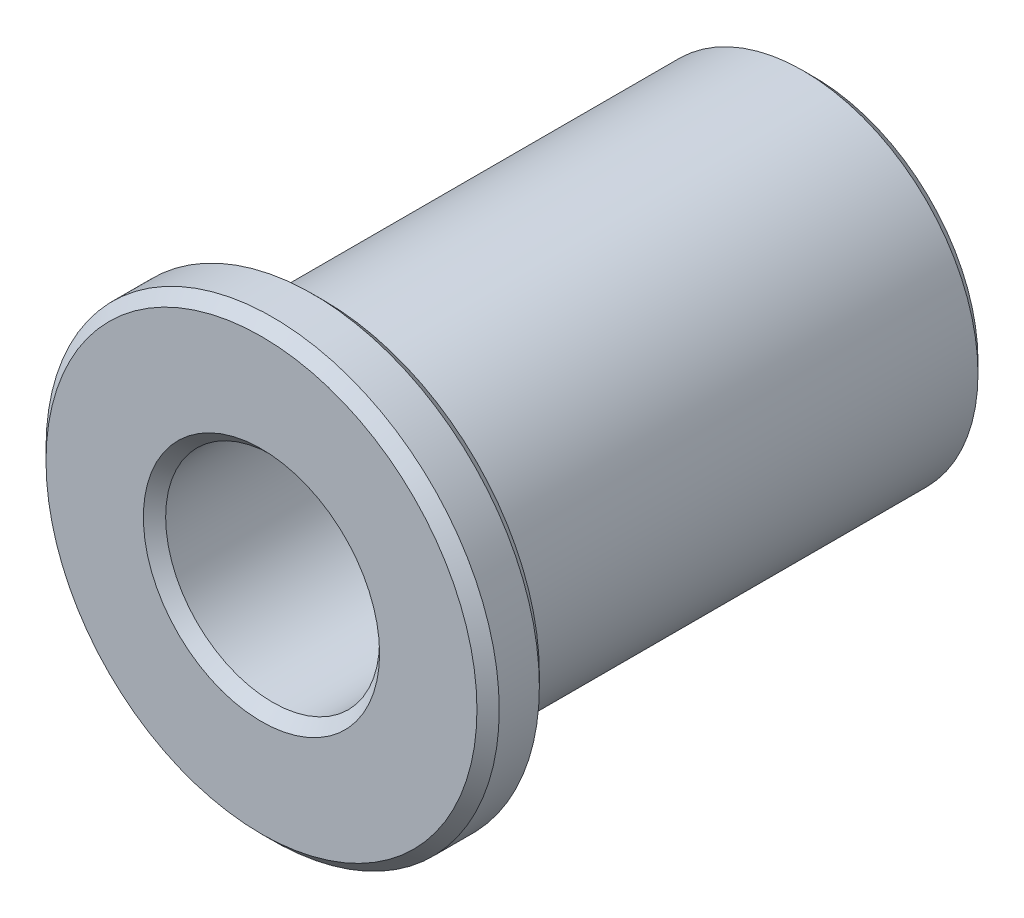
ISO-10303-21;
HEADER;
FILE_DESCRIPTION(('STEP AP214'),'2;1');
FILE_NAME('part.step','',(''),(''),'','','');
FILE_SCHEMA(('AUTOMOTIVE_DESIGN { 1 0 10303 214 1 1 1 1 }'));
ENDSEC;
DATA;
#1=APPLICATION_CONTEXT('core data for automotive mechanical design processes');
#2=APPLICATION_PROTOCOL_DEFINITION('international standard','automotive_design',2000,#1);
#3=PRODUCT_CONTEXT('',#1,'mechanical');
#4=PRODUCT('Part','Part','',(#3));
#5=PRODUCT_RELATED_PRODUCT_CATEGORY('part','',(#4));
#6=PRODUCT_DEFINITION_FORMATION('','',#4);
#7=PRODUCT_DEFINITION_CONTEXT('part definition',#1,'design');
#8=PRODUCT_DEFINITION('design','',#6,#7);
#9=PRODUCT_DEFINITION_SHAPE('','',#8);
#10=(LENGTH_UNIT() NAMED_UNIT(*) SI_UNIT(.MILLI.,.METRE.));
#11=(NAMED_UNIT(*) PLANE_ANGLE_UNIT() SI_UNIT($,.RADIAN.));
#12=(NAMED_UNIT(*) SI_UNIT($,.STERADIAN.) SOLID_ANGLE_UNIT());
#13=UNCERTAINTY_MEASURE_WITH_UNIT(LENGTH_MEASURE(1.E-05),#10,'distance_accuracy_value','');
#14=(GEOMETRIC_REPRESENTATION_CONTEXT(3) GLOBAL_UNCERTAINTY_ASSIGNED_CONTEXT((#13)) GLOBAL_UNIT_ASSIGNED_CONTEXT((#10,
#11,#12)) REPRESENTATION_CONTEXT('',''));
#15=CARTESIAN_POINT('',(0.,0.,0.));
#16=DIRECTION('',(0.,0.,1.));
#17=DIRECTION('',(1.,0.,0.));
#18=AXIS2_PLACEMENT_3D('',#15,#16,#17);
#19=CARTESIAN_POINT('',(0.,0.,-11.));
#20=DIRECTION('',(0.,0.,1.));
#21=DIRECTION('',(1.,0.,0.));
#22=AXIS2_PLACEMENT_3D('',#19,#20,#21);
#23=CYLINDRICAL_SURFACE('',#22,3.925);
#24=CARTESIAN_POINT('',(0.,0.,-10.75));
#25=DIRECTION('',(0.,0.,1.));
#26=DIRECTION('',(1.,0.,0.));
#27=AXIS2_PLACEMENT_3D('',#24,#25,#26);
#28=CIRCLE('',#27,3.925);
#29=CARTESIAN_POINT('',(3.925,0.,-10.75));
#30=VERTEX_POINT('',#29);
#31=EDGE_CURVE('E50',#30,#30,#28,.T.);
#32=ORIENTED_EDGE('',*,*,#31,.T.);
#33=EDGE_LOOP('',(#32));
#34=FACE_BOUND('',#33,.T.);
#35=CARTESIAN_POINT('',(0.,0.,0.));
#36=DIRECTION('',(0.,0.,1.));
#37=DIRECTION('',(1.,0.,0.));
#38=AXIS2_PLACEMENT_3D('',#35,#36,#37);
#39=CIRCLE('',#38,3.925);
#40=CARTESIAN_POINT('',(3.925,0.,0.));
#41=VERTEX_POINT('',#40);
#42=EDGE_CURVE('E68',#41,#41,#39,.T.);
#43=ORIENTED_EDGE('',*,*,#42,.F.);
#44=EDGE_LOOP('',(#43));
#45=FACE_BOUND('',#44,.T.);
#46=ADVANCED_FACE('F30',(#34,#45),#23,.T.);
#47=CARTESIAN_POINT('',(0.,0.,-11.));
#48=DIRECTION('',(0.,0.,1.));
#49=DIRECTION('',(1.,0.,0.));
#50=AXIS2_PLACEMENT_3D('',#47,#48,#49);
#51=PLANE('',#50);
#52=CARTESIAN_POINT('',(0.,0.,-11.));
#53=DIRECTION('',(0.,0.,1.));
#54=DIRECTION('',(1.,0.,0.));
#55=AXIS2_PLACEMENT_3D('',#52,#53,#54);
#56=CIRCLE('',#55,3.67499999999999);
#57=CARTESIAN_POINT('',(3.67499999999999,0.,-11.));
#58=VERTEX_POINT('',#57);
#59=EDGE_CURVE('E41',#58,#58,#56,.F.);
#60=ORIENTED_EDGE('',*,*,#59,.T.);
#61=EDGE_LOOP('',(#60));
#62=FACE_BOUND('',#61,.T.);
#63=CARTESIAN_POINT('',(0.,0.,-11.));
#64=DIRECTION('',(0.,0.,1.));
#65=DIRECTION('',(1.,0.,0.));
#66=AXIS2_PLACEMENT_3D('',#63,#64,#65);
#67=CIRCLE('',#66,2.64999999999999);
#68=CARTESIAN_POINT('',(2.64999999999999,0.,-11.));
#69=VERTEX_POINT('',#68);
#70=EDGE_CURVE('E45',#69,#69,#67,.T.);
#71=ORIENTED_EDGE('',*,*,#70,.T.);
#72=EDGE_LOOP('',(#71));
#73=FACE_BOUND('',#72,.T.);
#74=ADVANCED_FACE('F75',(#62,#73),#51,.F.);
#75=CARTESIAN_POINT('',(0.,0.,1.4));
#76=DIRECTION('',(0.,0.,-1.));
#77=DIRECTION('',(-1.,0.,0.));
#78=AXIS2_PLACEMENT_3D('',#75,#76,#77);
#79=CYLINDRICAL_SURFACE('',#78,5.08414963527469);
#80=CARTESIAN_POINT('',(0.,0.,0.250000000000003));
#81=DIRECTION('',(0.,0.,1.));
#82=DIRECTION('',(1.,0.,0.));
#83=AXIS2_PLACEMENT_3D('',#80,#81,#82);
#84=CIRCLE('',#83,5.08414963527469);
#85=CARTESIAN_POINT('',(5.08414963527469,0.,0.250000000000003));
#86=VERTEX_POINT('',#85);
#87=EDGE_CURVE('E62',#86,#86,#84,.T.);
#88=ORIENTED_EDGE('',*,*,#87,.T.);
#89=EDGE_LOOP('',(#88));
#90=FACE_BOUND('',#89,.T.);
#91=CARTESIAN_POINT('',(0.,0.,1.15));
#92=DIRECTION('',(0.,0.,1.));
#93=DIRECTION('',(1.,0.,0.));
#94=AXIS2_PLACEMENT_3D('',#91,#92,#93);
#95=CIRCLE('',#94,5.08414963527469);
#96=CARTESIAN_POINT('',(5.08414963527469,0.,1.15));
#97=VERTEX_POINT('',#96);
#98=EDGE_CURVE('E65',#97,#97,#95,.F.);
#99=ORIENTED_EDGE('',*,*,#98,.T.);
#100=EDGE_LOOP('',(#99));
#101=FACE_BOUND('',#100,.T.);
#102=ADVANCED_FACE('F81',(#90,#101),#79,.T.);
#103=CARTESIAN_POINT('',(0.,0.,1.4));
#104=DIRECTION('',(0.,0.,1.));
#105=DIRECTION('',(1.,0.,0.));
#106=AXIS2_PLACEMENT_3D('',#103,#104,#105);
#107=PLANE('',#106);
#108=CARTESIAN_POINT('',(0.,0.,1.4));
#109=DIRECTION('',(0.,0.,1.));
#110=DIRECTION('',(1.,0.,0.));
#111=AXIS2_PLACEMENT_3D('',#108,#109,#110);
#112=CIRCLE('',#111,4.83414963527468);
#113=CARTESIAN_POINT('',(4.83414963527468,0.,1.4));
#114=VERTEX_POINT('',#113);
#115=EDGE_CURVE('E53',#114,#114,#112,.T.);
#116=ORIENTED_EDGE('',*,*,#115,.T.);
#117=EDGE_LOOP('',(#116));
#118=FACE_BOUND('',#117,.T.);
#119=CARTESIAN_POINT('',(0.,0.,1.4));
#120=DIRECTION('',(0.,0.,1.));
#121=DIRECTION('',(1.,0.,0.));
#122=AXIS2_PLACEMENT_3D('',#119,#120,#121);
#123=CIRCLE('',#122,2.65000000000001);
#124=CARTESIAN_POINT('',(2.65000000000001,0.,1.4));
#125=VERTEX_POINT('',#124);
#126=EDGE_CURVE('E56',#125,#125,#123,.F.);
#127=ORIENTED_EDGE('',*,*,#126,.T.);
#128=EDGE_LOOP('',(#127));
#129=FACE_BOUND('',#128,.T.);
#130=ADVANCED_FACE('F113',(#118,#129),#107,.T.);
#131=CARTESIAN_POINT('',(0.,0.,0.));
#132=DIRECTION('',(0.,0.,1.));
#133=DIRECTION('',(1.,0.,0.));
#134=AXIS2_PLACEMENT_3D('',#131,#132,#133);
#135=PLANE('',#134);
#136=CARTESIAN_POINT('',(0.,0.,0.));
#137=DIRECTION('',(0.,0.,1.));
#138=DIRECTION('',(1.,0.,0.));
#139=AXIS2_PLACEMENT_3D('',#136,#137,#138);
#140=CIRCLE('',#139,4.83414963527468);
#141=CARTESIAN_POINT('',(4.83414963527468,0.,0.));
#142=VERTEX_POINT('',#141);
#143=EDGE_CURVE('E59',#142,#142,#140,.F.);
#144=ORIENTED_EDGE('',*,*,#143,.T.);
#145=EDGE_LOOP('',(#144));
#146=FACE_BOUND('',#145,.T.);
#147=ORIENTED_EDGE('',*,*,#42,.T.);
#148=EDGE_LOOP('',(#147));
#149=FACE_BOUND('',#148,.T.);
#150=ADVANCED_FACE('F72',(#146,#149),#135,.F.);
#151=CARTESIAN_POINT('',(0.,0.,-11.));
#152=DIRECTION('',(0.,0.,1.));
#153=DIRECTION('',(1.,0.,0.));
#154=AXIS2_PLACEMENT_3D('',#151,#152,#153);
#155=CYLINDRICAL_SURFACE('',#154,2.4);
#156=CARTESIAN_POINT('',(0.,0.,-10.75));
#157=DIRECTION('',(0.,0.,1.));
#158=DIRECTION('',(1.,0.,0.));
#159=AXIS2_PLACEMENT_3D('',#156,#157,#158);
#160=CIRCLE('',#159,2.4);
#161=CARTESIAN_POINT('',(2.4,0.,-10.75));
#162=VERTEX_POINT('',#161);
#163=EDGE_CURVE('E10',#162,#162,#160,.F.);
#164=CARTESIAN_POINT('',(0.,0.,1.14999999999999));
#165=DIRECTION('',(0.,0.,1.));
#166=DIRECTION('',(1.,0.,0.));
#167=AXIS2_PLACEMENT_3D('',#164,#165,#166);
#168=CIRCLE('',#167,2.4);
#169=CARTESIAN_POINT('',(2.4,0.,1.14999999999999));
#170=VERTEX_POINT('',#169);
#171=EDGE_CURVE('E37',#170,#170,#168,.T.);
#172=CARTESIAN_POINT('',(2.4,0.,-10.75));
#173=CARTESIAN_POINT('',(2.4,0.,-10.6260416666667));
#174=CARTESIAN_POINT('',(2.4,0.,-10.5020833333333));
#175=CARTESIAN_POINT('',(2.4,0.,-10.2541666666667));
#176=CARTESIAN_POINT('',(2.4,0.,-10.1302083333333));
#177=CARTESIAN_POINT('',(2.4,0.,-9.88229166666667));
#178=CARTESIAN_POINT('',(2.4,0.,-9.75833333333334));
#179=CARTESIAN_POINT('',(2.4,0.,-9.51041666666667));
#180=CARTESIAN_POINT('',(2.4,0.,-9.38645833333334));
#181=CARTESIAN_POINT('',(2.4,0.,-9.13854166666667));
#182=CARTESIAN_POINT('',(2.4,0.,-9.01458333333334));
#183=CARTESIAN_POINT('',(2.4,0.,-8.76666666666667));
#184=CARTESIAN_POINT('',(2.4,0.,-8.64270833333334));
#185=CARTESIAN_POINT('',(2.4,0.,-8.39479166666667));
#186=CARTESIAN_POINT('',(2.4,0.,-8.27083333333334));
#187=CARTESIAN_POINT('',(2.4,0.,-8.02291666666667));
#188=CARTESIAN_POINT('',(2.4,0.,-7.89895833333334));
#189=CARTESIAN_POINT('',(2.4,0.,-7.65104166666667));
#190=CARTESIAN_POINT('',(2.4,0.,-7.52708333333334));
#191=CARTESIAN_POINT('',(2.4,0.,-7.27916666666667));
#192=CARTESIAN_POINT('',(2.4,0.,-7.15520833333334));
#193=CARTESIAN_POINT('',(2.4,0.,-6.90729166666668));
#194=CARTESIAN_POINT('',(2.4,0.,-6.78333333333334));
#195=CARTESIAN_POINT('',(2.4,0.,-6.53541666666668));
#196=CARTESIAN_POINT('',(2.4,0.,-6.41145833333334));
#197=CARTESIAN_POINT('',(2.4,0.,-6.16354166666668));
#198=CARTESIAN_POINT('',(2.4,0.,-6.03958333333334));
#199=CARTESIAN_POINT('',(2.4,0.,-5.79166666666668));
#200=CARTESIAN_POINT('',(2.4,0.,-5.66770833333334));
#201=CARTESIAN_POINT('',(2.4,0.,-5.41979166666668));
#202=CARTESIAN_POINT('',(2.4,0.,-5.29583333333334));
#203=CARTESIAN_POINT('',(2.4,0.,-5.04791666666668));
#204=CARTESIAN_POINT('',(2.4,0.,-4.92395833333334));
#205=CARTESIAN_POINT('',(2.4,0.,-4.67604166666668));
#206=CARTESIAN_POINT('',(2.4,0.,-4.55208333333334));
#207=CARTESIAN_POINT('',(2.4,0.,-4.30416666666668));
#208=CARTESIAN_POINT('',(2.4,0.,-4.18020833333334));
#209=CARTESIAN_POINT('',(2.4,0.,-3.93229166666668));
#210=CARTESIAN_POINT('',(2.4,0.,-3.80833333333334));
#211=CARTESIAN_POINT('',(2.4,0.,-3.56041666666668));
#212=CARTESIAN_POINT('',(2.4,0.,-3.43645833333334));
#213=CARTESIAN_POINT('',(2.4,0.,-3.18854166666668));
#214=CARTESIAN_POINT('',(2.4,0.,-3.06458333333334));
#215=CARTESIAN_POINT('',(2.4,0.,-2.81666666666668));
#216=CARTESIAN_POINT('',(2.4,0.,-2.69270833333335));
#217=CARTESIAN_POINT('',(2.4,0.,-2.44479166666668));
#218=CARTESIAN_POINT('',(2.4,0.,-2.32083333333334));
#219=CARTESIAN_POINT('',(2.4,0.,-2.07291666666668));
#220=CARTESIAN_POINT('',(2.4,0.,-1.94895833333335));
#221=CARTESIAN_POINT('',(2.4,0.,-1.70104166666668));
#222=CARTESIAN_POINT('',(2.4,0.,-1.57708333333335));
#223=CARTESIAN_POINT('',(2.4,0.,-1.32916666666668));
#224=CARTESIAN_POINT('',(2.4,0.,-1.20520833333335));
#225=CARTESIAN_POINT('',(2.4,0.,-0.957291666666679));
#226=CARTESIAN_POINT('',(2.4,0.,-0.833333333333346));
#227=CARTESIAN_POINT('',(2.4,0.,-0.585416666666679));
#228=CARTESIAN_POINT('',(2.4,0.,-0.461458333333346));
#229=CARTESIAN_POINT('',(2.4,0.,-0.21354166666668));
#230=CARTESIAN_POINT('',(2.4,0.,-0.089583333333346));
#231=CARTESIAN_POINT('',(2.4,0.,0.158333333333321));
#232=CARTESIAN_POINT('',(2.4,0.,0.282291666666654));
#233=CARTESIAN_POINT('',(2.4,0.,0.53020833333332));
#234=CARTESIAN_POINT('',(2.4,0.,0.654166666666654));
#235=CARTESIAN_POINT('',(2.4,0.,0.90208333333332));
#236=CARTESIAN_POINT('',(2.4,0.,1.02604166666665));
#237=CARTESIAN_POINT('',(2.4,0.,1.14999999999999));
#238=B_SPLINE_CURVE_WITH_KNOTS('',3,(#172,#173,#174,#175,#176,#177,#178,#179,#180,#181,#182,
#183,#184,#185,#186,#187,#188,#189,#190,#191,#192,#193,#194,#195,#196,#197,#198,#199,#200,#201,
#202,#203,#204,#205,#206,#207,#208,#209,#210,#211,#212,#213,#214,#215,#216,#217,#218,#219,#220,
#221,#222,#223,#224,#225,#226,#227,#228,#229,#230,#231,#232,#233,#234,#235,#236,#237),
.UNSPECIFIED.,.F.,.F.,(4,2,2,2,2,2,2,2,2,2,2,2,2,2,2,2,2,2,2,2,2,2,2,2,2,2,2,2,2,2,2,2,4),(0.,
0.371874999999999,0.743749999999998,1.115625,1.4875,1.859375,2.23125,2.603125,2.975,3.346875,
3.71875,4.090625,4.4625,4.834375,5.20624999999999,5.57812499999999,5.94999999999999,
6.32187499999999,6.69374999999999,7.06562499999999,7.43749999999999,7.80937499999999,
8.18124999999999,8.55312499999999,8.92499999999999,9.29687499999999,9.66874999999999,10.040625,
10.4125,10.784375,11.15625,11.528125,11.9),.UNSPECIFIED.);
#239=EDGE_CURVE('BSEAM90',#162,#170,#238,.T.);
#240=ORIENTED_EDGE('',*,*,#163,.T.);
#241=ORIENTED_EDGE('',*,*,#171,.T.);
#242=ORIENTED_EDGE('',*,*,#239,.T.);
#243=ORIENTED_EDGE('',*,*,#239,.F.);
#244=EDGE_LOOP('',(#240,#242,#241,#243));
#245=FACE_BOUND('',#244,.T.);
#246=ADVANCED_FACE('F90',(#245),#155,.F.);
#247=CARTESIAN_POINT('',(0.,0.,0.250000000000003));
#248=DIRECTION('',(0.,0.,1.));
#249=DIRECTION('',(1.,0.,0.));
#250=AXIS2_PLACEMENT_3D('',#247,#248,#249);
#251=CONICAL_SURFACE('',#250,5.08414963527469,0.785398163397452);
#252=ORIENTED_EDGE('',*,*,#143,.F.);
#253=EDGE_LOOP('',(#252));
#254=FACE_BOUND('',#253,.T.);
#255=ORIENTED_EDGE('',*,*,#87,.F.);
#256=EDGE_LOOP('',(#255));
#257=FACE_BOUND('',#256,.T.);
#258=ADVANCED_FACE('F86',(#254,#257),#251,.T.);
#259=CARTESIAN_POINT('',(0.,0.,1.4));
#260=DIRECTION('',(0.,0.,-1.));
#261=DIRECTION('',(-1.,0.,0.));
#262=AXIS2_PLACEMENT_3D('',#259,#260,#261);
#263=CONICAL_SURFACE('',#262,4.83414963527468,0.785398163397452);
#264=ORIENTED_EDGE('',*,*,#98,.F.);
#265=EDGE_LOOP('',(#264));
#266=FACE_BOUND('',#265,.T.);
#267=ORIENTED_EDGE('',*,*,#115,.F.);
#268=EDGE_LOOP('',(#267));
#269=FACE_BOUND('',#268,.T.);
#270=ADVANCED_FACE('F89',(#266,#269),#263,.T.);
#271=CARTESIAN_POINT('',(0.,0.,-10.75));
#272=DIRECTION('',(0.,0.,1.));
#273=DIRECTION('',(1.,0.,0.));
#274=AXIS2_PLACEMENT_3D('',#271,#272,#273);
#275=CONICAL_SURFACE('',#274,3.925,0.785398163397452);
#276=ORIENTED_EDGE('',*,*,#59,.F.);
#277=EDGE_LOOP('',(#276));
#278=FACE_BOUND('',#277,.T.);
#279=ORIENTED_EDGE('',*,*,#31,.F.);
#280=EDGE_LOOP('',(#279));
#281=FACE_BOUND('',#280,.T.);
#282=ADVANCED_FACE('F94',(#278,#281),#275,.T.);
#283=CARTESIAN_POINT('',(0.,0.,-11.));
#284=DIRECTION('',(0.,0.,-1.));
#285=DIRECTION('',(-1.,0.,0.));
#286=AXIS2_PLACEMENT_3D('',#283,#284,#285);
#287=CONICAL_SURFACE('',#286,2.64999999999999,0.785398163397447);
#288=ORIENTED_EDGE('',*,*,#163,.F.);
#289=EDGE_LOOP('',(#288));
#290=FACE_BOUND('',#289,.T.);
#291=ORIENTED_EDGE('',*,*,#70,.F.);
#292=EDGE_LOOP('',(#291));
#293=FACE_BOUND('',#292,.T.);
#294=ADVANCED_FACE('F97',(#290,#293),#287,.F.);
#295=CARTESIAN_POINT('',(0.,0.,1.14999999999999));
#296=DIRECTION('',(0.,0.,1.));
#297=DIRECTION('',(1.,0.,0.));
#298=AXIS2_PLACEMENT_3D('',#295,#296,#297);
#299=CONICAL_SURFACE('',#298,2.4,0.785398163397453);
#300=ORIENTED_EDGE('',*,*,#126,.F.);
#301=EDGE_LOOP('',(#300));
#302=FACE_BOUND('',#301,.T.);
#303=ORIENTED_EDGE('',*,*,#171,.F.);
#304=EDGE_LOOP('',(#303));
#305=FACE_BOUND('',#304,.T.);
#306=ADVANCED_FACE('F32',(#302,#305),#299,.F.);
#307=CLOSED_SHELL('',(#46,#74,#102,#130,#150,#246,#258,#270,#282,#294,#306));
#308=MANIFOLD_SOLID_BREP('B2',#307);
#309=ADVANCED_BREP_SHAPE_REPRESENTATION('',(#18,#308),#14);
#310=SHAPE_DEFINITION_REPRESENTATION(#9,#309);
ENDSEC;
END-ISO-10303-21;
